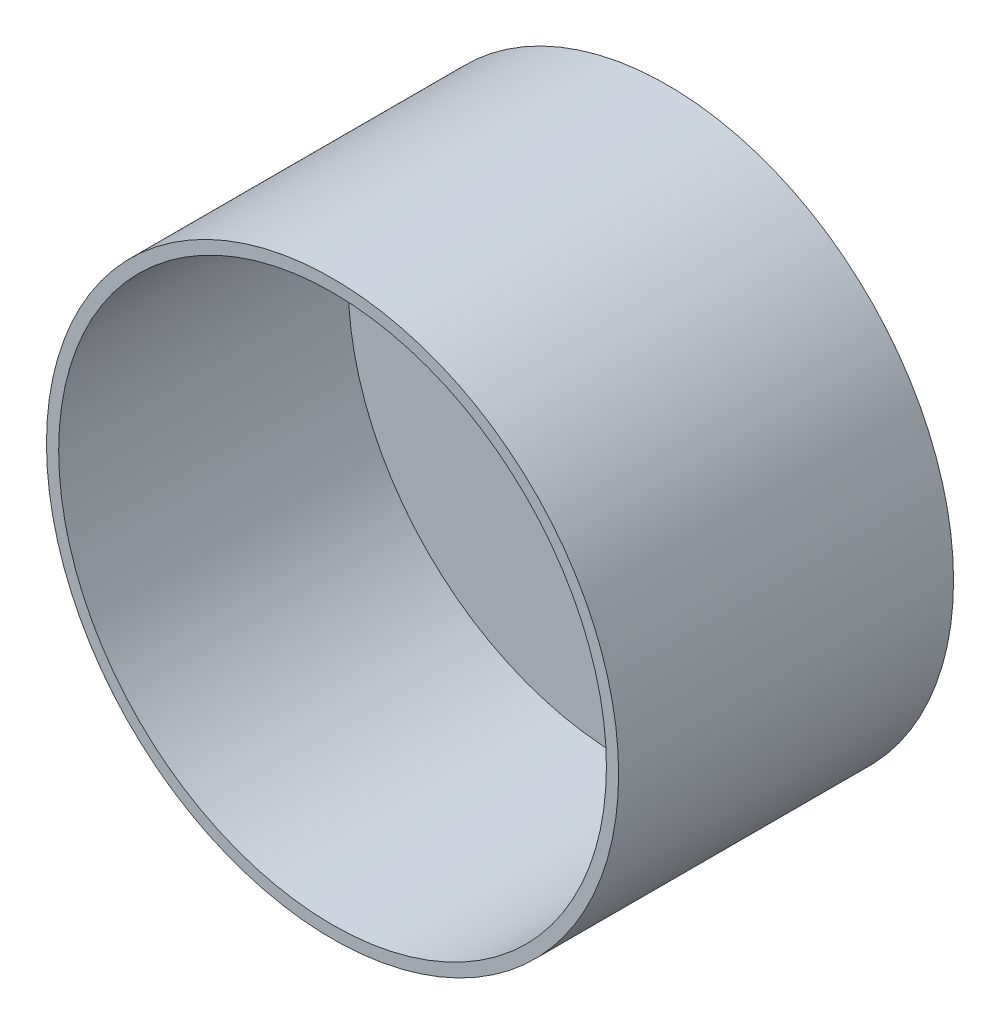
ISO-10303-21;
HEADER;
FILE_DESCRIPTION(('STEP AP214'),'2;1');
FILE_NAME('part.step','',(''),(''),'','','');
FILE_SCHEMA(('AUTOMOTIVE_DESIGN { 1 0 10303 214 1 1 1 1 }'));
ENDSEC;
DATA;
#1=APPLICATION_CONTEXT('core data for automotive mechanical design processes');
#2=APPLICATION_PROTOCOL_DEFINITION('international standard','automotive_design',2000,#1);
#3=PRODUCT_CONTEXT('',#1,'mechanical');
#4=PRODUCT('Part','Part','',(#3));
#5=PRODUCT_RELATED_PRODUCT_CATEGORY('part','',(#4));
#6=PRODUCT_DEFINITION_FORMATION('','',#4);
#7=PRODUCT_DEFINITION_CONTEXT('part definition',#1,'design');
#8=PRODUCT_DEFINITION('design','',#6,#7);
#9=PRODUCT_DEFINITION_SHAPE('','',#8);
#10=(LENGTH_UNIT() NAMED_UNIT(*) SI_UNIT(.MILLI.,.METRE.));
#11=(NAMED_UNIT(*) PLANE_ANGLE_UNIT() SI_UNIT($,.RADIAN.));
#12=(NAMED_UNIT(*) SI_UNIT($,.STERADIAN.) SOLID_ANGLE_UNIT());
#13=UNCERTAINTY_MEASURE_WITH_UNIT(LENGTH_MEASURE(1.E-05),#10,'distance_accuracy_value','');
#14=(GEOMETRIC_REPRESENTATION_CONTEXT(3) GLOBAL_UNCERTAINTY_ASSIGNED_CONTEXT((#13)) GLOBAL_UNIT_ASSIGNED_CONTEXT((#10,
#11,#12)) REPRESENTATION_CONTEXT('',''));
#15=CARTESIAN_POINT('',(0.,0.,0.));
#16=DIRECTION('',(0.,0.,1.));
#17=DIRECTION('',(1.,0.,0.));
#18=AXIS2_PLACEMENT_3D('',#15,#16,#17);
#19=CARTESIAN_POINT('',(0.,0.,48.));
#20=DIRECTION('',(0.,0.,-1.));
#21=DIRECTION('',(-1.,0.,0.));
#22=AXIS2_PLACEMENT_3D('',#19,#20,#21);
#23=CYLINDRICAL_SURFACE('',#22,41.);
#24=CARTESIAN_POINT('',(0.,0.,48.));
#25=DIRECTION('',(0.,0.,1.));
#26=DIRECTION('',(1.,0.,0.));
#27=AXIS2_PLACEMENT_3D('',#24,#25,#26);
#28=CIRCLE('',#27,41.);
#29=CARTESIAN_POINT('',(41.,0.,48.));
#30=VERTEX_POINT('',#29);
#31=EDGE_CURVE('E10',#30,#30,#28,.T.);
#32=ORIENTED_EDGE('',*,*,#31,.F.);
#33=EDGE_LOOP('',(#32));
#34=FACE_BOUND('',#33,.T.);
#35=CARTESIAN_POINT('',(0.,0.,0.));
#36=DIRECTION('',(0.,0.,1.));
#37=DIRECTION('',(1.,0.,0.));
#38=AXIS2_PLACEMENT_3D('',#35,#36,#37);
#39=CIRCLE('',#38,41.);
#40=CARTESIAN_POINT('',(41.,0.,0.));
#41=VERTEX_POINT('',#40);
#42=EDGE_CURVE('E42',#41,#41,#39,.T.);
#43=ORIENTED_EDGE('',*,*,#42,.T.);
#44=EDGE_LOOP('',(#43));
#45=FACE_BOUND('',#44,.T.);
#46=ADVANCED_FACE('F39',(#34,#45),#23,.T.);
#47=CARTESIAN_POINT('',(0.,0.,48.));
#48=DIRECTION('',(0.,0.,1.));
#49=DIRECTION('',(1.,0.,0.));
#50=AXIS2_PLACEMENT_3D('',#47,#48,#49);
#51=PLANE('',#50);
#52=CARTESIAN_POINT('',(0.,0.,48.));
#53=DIRECTION('',(0.,0.,1.));
#54=DIRECTION('',(1.,0.,0.));
#55=AXIS2_PLACEMENT_3D('',#52,#53,#54);
#56=CIRCLE('',#55,39.25);
#57=CARTESIAN_POINT('',(39.25,0.,48.));
#58=VERTEX_POINT('',#57);
#59=EDGE_CURVE('E51',#58,#58,#56,.T.);
#60=ORIENTED_EDGE('',*,*,#59,.F.);
#61=EDGE_LOOP('',(#60));
#62=FACE_BOUND('',#61,.T.);
#63=ORIENTED_EDGE('',*,*,#31,.T.);
#64=EDGE_LOOP('',(#63));
#65=FACE_BOUND('',#64,.T.);
#66=ADVANCED_FACE('F66',(#62,#65),#51,.T.);
#67=CARTESIAN_POINT('',(0.,0.,0.));
#68=DIRECTION('',(0.,0.,1.));
#69=DIRECTION('',(1.,0.,0.));
#70=AXIS2_PLACEMENT_3D('',#67,#68,#69);
#71=PLANE('',#70);
#72=ORIENTED_EDGE('',*,*,#42,.F.);
#73=EDGE_LOOP('',(#72));
#74=FACE_BOUND('',#73,.T.);
#75=ADVANCED_FACE('F62',(#74),#71,.F.);
#76=CARTESIAN_POINT('',(0.,0.,6.5));
#77=DIRECTION('',(0.,0.,1.));
#78=DIRECTION('',(1.,0.,0.));
#79=AXIS2_PLACEMENT_3D('',#76,#77,#78);
#80=CYLINDRICAL_SURFACE('',#79,39.25);
#81=CARTESIAN_POINT('',(0.,0.,6.5));
#82=DIRECTION('',(0.,0.,1.));
#83=DIRECTION('',(1.,0.,0.));
#84=AXIS2_PLACEMENT_3D('',#81,#82,#83);
#85=CIRCLE('',#84,39.25);
#86=CARTESIAN_POINT('',(39.25,0.,6.5));
#87=VERTEX_POINT('',#86);
#88=EDGE_CURVE('E49',#87,#87,#85,.T.);
#89=ORIENTED_EDGE('',*,*,#88,.F.);
#90=EDGE_LOOP('',(#89));
#91=FACE_BOUND('',#90,.T.);
#92=ORIENTED_EDGE('',*,*,#59,.T.);
#93=EDGE_LOOP('',(#92));
#94=FACE_BOUND('',#93,.T.);
#95=ADVANCED_FACE('F59',(#91,#94),#80,.F.);
#96=CARTESIAN_POINT('',(0.,0.,6.5));
#97=DIRECTION('',(0.,0.,1.));
#98=DIRECTION('',(1.,0.,0.));
#99=AXIS2_PLACEMENT_3D('',#96,#97,#98);
#100=PLANE('',#99);
#101=ORIENTED_EDGE('',*,*,#88,.T.);
#102=EDGE_LOOP('',(#101));
#103=FACE_BOUND('',#102,.T.);
#104=ADVANCED_FACE('F57',(#103),#100,.T.);
#105=CLOSED_SHELL('',(#46,#66,#75,#95,#104));
#106=MANIFOLD_SOLID_BREP('B2',#105);
#107=ADVANCED_BREP_SHAPE_REPRESENTATION('',(#18,#106),#14);
#108=SHAPE_DEFINITION_REPRESENTATION(#9,#107);
ENDSEC;
END-ISO-10303-21;
